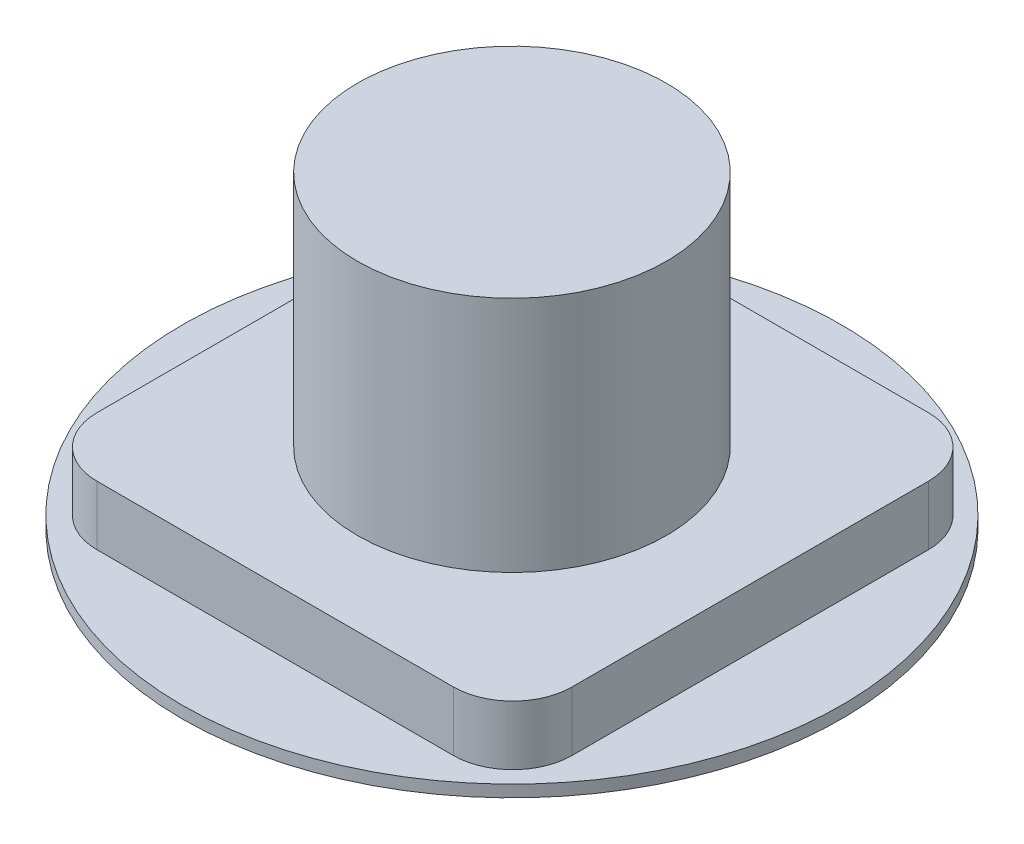
ISO-10303-21;
HEADER;
FILE_DESCRIPTION(('STEP AP214'),'2;1');
FILE_NAME('part.step','',(''),(''),'','','');
FILE_SCHEMA(('AUTOMOTIVE_DESIGN { 1 0 10303 214 1 1 1 1 }'));
ENDSEC;
DATA;
#1=APPLICATION_CONTEXT('core data for automotive mechanical design processes');
#2=APPLICATION_PROTOCOL_DEFINITION('international standard','automotive_design',2000,#1);
#3=PRODUCT_CONTEXT('',#1,'mechanical');
#4=PRODUCT('Part','Part','',(#3));
#5=PRODUCT_RELATED_PRODUCT_CATEGORY('part','',(#4));
#6=PRODUCT_DEFINITION_FORMATION('','',#4);
#7=PRODUCT_DEFINITION_CONTEXT('part definition',#1,'design');
#8=PRODUCT_DEFINITION('design','',#6,#7);
#9=PRODUCT_DEFINITION_SHAPE('','',#8);
#10=(LENGTH_UNIT() NAMED_UNIT(*) SI_UNIT(.MILLI.,.METRE.));
#11=(NAMED_UNIT(*) PLANE_ANGLE_UNIT() SI_UNIT($,.RADIAN.));
#12=(NAMED_UNIT(*) SI_UNIT($,.STERADIAN.) SOLID_ANGLE_UNIT());
#13=UNCERTAINTY_MEASURE_WITH_UNIT(LENGTH_MEASURE(1.E-05),#10,'distance_accuracy_value','');
#14=(GEOMETRIC_REPRESENTATION_CONTEXT(3) GLOBAL_UNCERTAINTY_ASSIGNED_CONTEXT((#13)) GLOBAL_UNIT_ASSIGNED_CONTEXT((#10,
#11,#12)) REPRESENTATION_CONTEXT('',''));
#15=CARTESIAN_POINT('',(0.,0.,0.));
#16=DIRECTION('',(0.,0.,1.));
#17=DIRECTION('',(1.,0.,0.));
#18=AXIS2_PLACEMENT_3D('',#15,#16,#17);
#19=CARTESIAN_POINT('',(0.,10.,0.));
#20=DIRECTION('',(0.,1.,0.));
#21=DIRECTION('',(0.,0.,1.));
#22=AXIS2_PLACEMENT_3D('',#19,#20,#21);
#23=PLANE('',#22);
#24=CARTESIAN_POINT('',(0.,10.,0.));
#25=DIRECTION('',(0.,1.,0.));
#26=DIRECTION('',(0.,0.,1.));
#27=AXIS2_PLACEMENT_3D('',#24,#25,#26);
#28=CIRCLE('',#27,277.5);
#29=CARTESIAN_POINT('',(0.,10.,277.5));
#30=VERTEX_POINT('',#29);
#31=EDGE_CURVE('E187',#30,#30,#28,.T.);
#32=ORIENTED_EDGE('',*,*,#31,.T.);
#33=EDGE_LOOP('',(#32));
#34=FACE_BOUND('',#33,.T.);
#35=DIRECTION('',(0.,0.,1.));
#36=VECTOR('',#35,1.);
#37=CARTESIAN_POINT('',(-199.348769717214,10.,-200.));
#38=LINE('',#37,#36);
#39=CARTESIAN_POINT('',(-199.348769717214,10.,-150.));
#40=VERTEX_POINT('',#39);
#41=CARTESIAN_POINT('',(-199.348769717214,10.,150.));
#42=VERTEX_POINT('',#41);
#43=EDGE_CURVE('E109',#40,#42,#38,.T.);
#44=ORIENTED_EDGE('',*,*,#43,.F.);
#45=CARTESIAN_POINT('',(-149.348769717214,10.,-150.));
#46=DIRECTION('',(0.,1.,0.));
#47=DIRECTION('',(0.,0.,1.));
#48=AXIS2_PLACEMENT_3D('',#45,#46,#47);
#49=CIRCLE('',#48,50.);
#50=CARTESIAN_POINT('',(-149.348769717214,10.,-200.));
#51=VERTEX_POINT('',#50);
#52=EDGE_CURVE('E155',#40,#51,#49,.F.);
#53=ORIENTED_EDGE('',*,*,#52,.T.);
#54=DIRECTION('',(-1.,0.,0.));
#55=VECTOR('',#54,1.);
#56=CARTESIAN_POINT('',(-199.348769717214,10.,-200.));
#57=LINE('',#56,#55);
#58=CARTESIAN_POINT('',(150.651230282786,10.,-200.));
#59=VERTEX_POINT('',#58);
#60=EDGE_CURVE('E123',#59,#51,#57,.T.);
#61=ORIENTED_EDGE('',*,*,#60,.F.);
#62=CARTESIAN_POINT('',(150.651230282786,10.,-150.));
#63=DIRECTION('',(0.,1.,0.));
#64=DIRECTION('',(0.,0.,1.));
#65=AXIS2_PLACEMENT_3D('',#62,#63,#64);
#66=CIRCLE('',#65,50.);
#67=CARTESIAN_POINT('',(200.651230282786,10.,-150.));
#68=VERTEX_POINT('',#67);
#69=EDGE_CURVE('E157',#59,#68,#66,.F.);
#70=ORIENTED_EDGE('',*,*,#69,.T.);
#71=DIRECTION('',(0.,0.,-1.));
#72=VECTOR('',#71,1.);
#73=CARTESIAN_POINT('',(200.651230282786,10.,-200.));
#74=LINE('',#73,#72);
#75=CARTESIAN_POINT('',(200.651230282786,10.,150.));
#76=VERTEX_POINT('',#75);
#77=EDGE_CURVE('E127',#76,#68,#74,.T.);
#78=ORIENTED_EDGE('',*,*,#77,.F.);
#79=CARTESIAN_POINT('',(150.651230282786,10.,150.));
#80=DIRECTION('',(0.,1.,0.));
#81=DIRECTION('',(0.,0.,1.));
#82=AXIS2_PLACEMENT_3D('',#79,#80,#81);
#83=CIRCLE('',#82,50.);
#84=CARTESIAN_POINT('',(150.651230282786,10.,200.));
#85=VERTEX_POINT('',#84);
#86=EDGE_CURVE('E56',#76,#85,#83,.F.);
#87=ORIENTED_EDGE('',*,*,#86,.T.);
#88=DIRECTION('',(1.,0.,0.));
#89=VECTOR('',#88,1.);
#90=CARTESIAN_POINT('',(-199.348769717214,10.,200.));
#91=LINE('',#90,#89);
#92=CARTESIAN_POINT('',(-149.348769717214,10.,200.));
#93=VERTEX_POINT('',#92);
#94=EDGE_CURVE('E110',#93,#85,#91,.T.);
#95=ORIENTED_EDGE('',*,*,#94,.F.);
#96=CARTESIAN_POINT('',(-149.348769717214,10.,150.));
#97=DIRECTION('',(0.,1.,0.));
#98=DIRECTION('',(0.,0.,1.));
#99=AXIS2_PLACEMENT_3D('',#96,#97,#98);
#100=CIRCLE('',#99,50.);
#101=EDGE_CURVE('E43',#93,#42,#100,.F.);
#102=ORIENTED_EDGE('',*,*,#101,.T.);
#103=EDGE_LOOP('',(#44,#53,#61,#70,#78,#87,#95,#102));
#104=FACE_BOUND('',#103,.T.);
#105=ADVANCED_FACE('F39',(#34,#104),#23,.T.);
#106=CARTESIAN_POINT('',(0.,10.,0.));
#107=DIRECTION('',(0.,-1.,0.));
#108=DIRECTION('',(0.,0.,-1.));
#109=AXIS2_PLACEMENT_3D('',#106,#107,#108);
#110=CYLINDRICAL_SURFACE('',#109,277.5);
#111=ORIENTED_EDGE('',*,*,#31,.F.);
#112=EDGE_LOOP('',(#111));
#113=FACE_BOUND('',#112,.T.);
#114=CARTESIAN_POINT('',(0.,0.,0.));
#115=DIRECTION('',(0.,1.,0.));
#116=DIRECTION('',(0.,0.,1.));
#117=AXIS2_PLACEMENT_3D('',#114,#115,#116);
#118=CIRCLE('',#117,277.5);
#119=CARTESIAN_POINT('',(0.,0.,277.5));
#120=VERTEX_POINT('',#119);
#121=EDGE_CURVE('E134',#120,#120,#118,.T.);
#122=ORIENTED_EDGE('',*,*,#121,.T.);
#123=EDGE_LOOP('',(#122));
#124=FACE_BOUND('',#123,.T.);
#125=ADVANCED_FACE('F195',(#113,#124),#110,.T.);
#126=CARTESIAN_POINT('',(0.,0.,0.));
#127=DIRECTION('',(0.,1.,0.));
#128=DIRECTION('',(0.,0.,1.));
#129=AXIS2_PLACEMENT_3D('',#126,#127,#128);
#130=PLANE('',#129);
#131=ORIENTED_EDGE('',*,*,#121,.F.);
#132=EDGE_LOOP('',(#131));
#133=FACE_BOUND('',#132,.T.);
#134=ADVANCED_FACE('F197',(#133),#130,.F.);
#135=CARTESIAN_POINT('',(200.651230282786,60.,-200.));
#136=DIRECTION('',(-1.,0.,0.));
#137=DIRECTION('',(0.,0.,1.));
#138=AXIS2_PLACEMENT_3D('',#135,#136,#137);
#139=PLANE('',#138);
#140=ORIENTED_EDGE('',*,*,#77,.T.);
#141=DIRECTION('',(0.,-1.,0.));
#142=VECTOR('',#141,1.);
#143=CARTESIAN_POINT('',(200.651230282786,60.,-150.));
#144=LINE('',#143,#142);
#145=CARTESIAN_POINT('',(200.651230282786,60.,-150.));
#146=VERTEX_POINT('',#145);
#147=EDGE_CURVE('E150',#68,#146,#144,.F.);
#148=ORIENTED_EDGE('',*,*,#147,.T.);
#149=DIRECTION('',(0.,0.,-1.));
#150=VECTOR('',#149,1.);
#151=CARTESIAN_POINT('',(200.651230282786,60.,-200.));
#152=LINE('',#151,#150);
#153=CARTESIAN_POINT('',(200.651230282786,60.,150.));
#154=VERTEX_POINT('',#153);
#155=EDGE_CURVE('E175',#154,#146,#152,.T.);
#156=ORIENTED_EDGE('',*,*,#155,.F.);
#157=DIRECTION('',(0.,-1.,0.));
#158=VECTOR('',#157,1.);
#159=CARTESIAN_POINT('',(200.651230282786,60.,150.));
#160=LINE('',#159,#158);
#161=EDGE_CURVE('E148',#154,#76,#160,.T.);
#162=ORIENTED_EDGE('',*,*,#161,.T.);
#163=EDGE_LOOP('',(#140,#148,#156,#162));
#164=FACE_BOUND('',#163,.T.);
#165=ADVANCED_FACE('F164',(#164),#139,.F.);
#166=CARTESIAN_POINT('',(-199.348769717214,60.,-200.));
#167=DIRECTION('',(0.,0.,1.));
#168=DIRECTION('',(1.,0.,0.));
#169=AXIS2_PLACEMENT_3D('',#166,#167,#168);
#170=PLANE('',#169);
#171=ORIENTED_EDGE('',*,*,#60,.T.);
#172=DIRECTION('',(0.,-1.,0.));
#173=VECTOR('',#172,1.);
#174=CARTESIAN_POINT('',(-149.348769717214,60.,-200.));
#175=LINE('',#174,#173);
#176=CARTESIAN_POINT('',(-149.348769717214,60.,-200.));
#177=VERTEX_POINT('',#176);
#178=EDGE_CURVE('E139',#51,#177,#175,.F.);
#179=ORIENTED_EDGE('',*,*,#178,.T.);
#180=DIRECTION('',(-1.,0.,0.));
#181=VECTOR('',#180,1.);
#182=CARTESIAN_POINT('',(-199.348769717214,60.,-200.));
#183=LINE('',#182,#181);
#184=CARTESIAN_POINT('',(150.651230282786,60.,-200.));
#185=VERTEX_POINT('',#184);
#186=EDGE_CURVE('E173',#185,#177,#183,.T.);
#187=ORIENTED_EDGE('',*,*,#186,.F.);
#188=DIRECTION('',(0.,-1.,0.));
#189=VECTOR('',#188,1.);
#190=CARTESIAN_POINT('',(150.651230282786,60.,-200.));
#191=LINE('',#190,#189);
#192=EDGE_CURVE('E129',#185,#59,#191,.T.);
#193=ORIENTED_EDGE('',*,*,#192,.T.);
#194=EDGE_LOOP('',(#171,#179,#187,#193));
#195=FACE_BOUND('',#194,.T.);
#196=ADVANCED_FACE('F177',(#195),#170,.F.);
#197=CARTESIAN_POINT('',(-199.348769717214,60.,-200.));
#198=DIRECTION('',(1.,0.,0.));
#199=DIRECTION('',(0.,0.,-1.));
#200=AXIS2_PLACEMENT_3D('',#197,#198,#199);
#201=PLANE('',#200);
#202=DIRECTION('',(0.,0.,1.));
#203=VECTOR('',#202,1.);
#204=CARTESIAN_POINT('',(-199.348769717214,60.,-200.));
#205=LINE('',#204,#203);
#206=CARTESIAN_POINT('',(-199.348769717214,60.,-150.));
#207=VERTEX_POINT('',#206);
#208=CARTESIAN_POINT('',(-199.348769717214,60.,150.));
#209=VERTEX_POINT('',#208);
#210=EDGE_CURVE('E179',#207,#209,#205,.T.);
#211=ORIENTED_EDGE('',*,*,#210,.F.);
#212=DIRECTION('',(0.,-1.,0.));
#213=VECTOR('',#212,1.);
#214=CARTESIAN_POINT('',(-199.348769717214,60.,-150.));
#215=LINE('',#214,#213);
#216=EDGE_CURVE('E122',#207,#40,#215,.T.);
#217=ORIENTED_EDGE('',*,*,#216,.T.);
#218=ORIENTED_EDGE('',*,*,#43,.T.);
#219=DIRECTION('',(0.,-1.,0.));
#220=VECTOR('',#219,1.);
#221=CARTESIAN_POINT('',(-199.348769717214,60.,150.));
#222=LINE('',#221,#220);
#223=EDGE_CURVE('E119',#42,#209,#222,.F.);
#224=ORIENTED_EDGE('',*,*,#223,.T.);
#225=EDGE_LOOP('',(#211,#217,#218,#224));
#226=FACE_BOUND('',#225,.T.);
#227=ADVANCED_FACE('F118',(#226),#201,.F.);
#228=CARTESIAN_POINT('',(-199.348769717214,60.,200.));
#229=DIRECTION('',(0.,0.,-1.));
#230=DIRECTION('',(-1.,0.,0.));
#231=AXIS2_PLACEMENT_3D('',#228,#229,#230);
#232=PLANE('',#231);
#233=ORIENTED_EDGE('',*,*,#94,.T.);
#234=DIRECTION('',(0.,-1.,0.));
#235=VECTOR('',#234,1.);
#236=CARTESIAN_POINT('',(150.651230282786,60.,200.));
#237=LINE('',#236,#235);
#238=CARTESIAN_POINT('',(150.651230282786,60.,200.));
#239=VERTEX_POINT('',#238);
#240=EDGE_CURVE('E82',#85,#239,#237,.F.);
#241=ORIENTED_EDGE('',*,*,#240,.T.);
#242=DIRECTION('',(1.,0.,0.));
#243=VECTOR('',#242,1.);
#244=CARTESIAN_POINT('',(-199.348769717214,60.,200.));
#245=LINE('',#244,#243);
#246=CARTESIAN_POINT('',(-149.348769717214,60.,200.));
#247=VERTEX_POINT('',#246);
#248=EDGE_CURVE('E181',#247,#239,#245,.T.);
#249=ORIENTED_EDGE('',*,*,#248,.F.);
#250=DIRECTION('',(0.,-1.,0.));
#251=VECTOR('',#250,1.);
#252=CARTESIAN_POINT('',(-149.348769717214,60.,200.));
#253=LINE('',#252,#251);
#254=EDGE_CURVE('E152',#247,#93,#253,.T.);
#255=ORIENTED_EDGE('',*,*,#254,.T.);
#256=EDGE_LOOP('',(#233,#241,#249,#255));
#257=FACE_BOUND('',#256,.T.);
#258=ADVANCED_FACE('F216',(#257),#232,.F.);
#259=CARTESIAN_POINT('',(0.,60.,0.));
#260=DIRECTION('',(0.,1.,0.));
#261=DIRECTION('',(0.,0.,1.));
#262=AXIS2_PLACEMENT_3D('',#259,#260,#261);
#263=PLANE('',#262);
#264=CARTESIAN_POINT('',(0.,60.,0.));
#265=DIRECTION('',(0.,1.,0.));
#266=DIRECTION('',(0.,0.,1.));
#267=AXIS2_PLACEMENT_3D('',#264,#265,#266);
#268=CIRCLE('',#267,130.);
#269=CARTESIAN_POINT('',(0.,60.,130.));
#270=VERTEX_POINT('',#269);
#271=EDGE_CURVE('E11',#270,#270,#268,.T.);
#272=ORIENTED_EDGE('',*,*,#271,.F.);
#273=EDGE_LOOP('',(#272));
#274=FACE_BOUND('',#273,.T.);
#275=ORIENTED_EDGE('',*,*,#186,.T.);
#276=CARTESIAN_POINT('',(-149.348769717214,60.,-150.));
#277=DIRECTION('',(0.,1.,0.));
#278=DIRECTION('',(0.,0.,1.));
#279=AXIS2_PLACEMENT_3D('',#276,#277,#278);
#280=CIRCLE('',#279,50.);
#281=EDGE_CURVE('E146',#177,#207,#280,.T.);
#282=ORIENTED_EDGE('',*,*,#281,.T.);
#283=ORIENTED_EDGE('',*,*,#210,.T.);
#284=CARTESIAN_POINT('',(-149.348769717214,60.,150.));
#285=DIRECTION('',(0.,1.,0.));
#286=DIRECTION('',(0.,0.,1.));
#287=AXIS2_PLACEMENT_3D('',#284,#285,#286);
#288=CIRCLE('',#287,50.);
#289=EDGE_CURVE('E126',#209,#247,#288,.T.);
#290=ORIENTED_EDGE('',*,*,#289,.T.);
#291=ORIENTED_EDGE('',*,*,#248,.T.);
#292=CARTESIAN_POINT('',(150.651230282786,60.,150.));
#293=DIRECTION('',(0.,1.,0.));
#294=DIRECTION('',(0.,0.,1.));
#295=AXIS2_PLACEMENT_3D('',#292,#293,#294);
#296=CIRCLE('',#295,50.);
#297=EDGE_CURVE('E142',#239,#154,#296,.T.);
#298=ORIENTED_EDGE('',*,*,#297,.T.);
#299=ORIENTED_EDGE('',*,*,#155,.T.);
#300=CARTESIAN_POINT('',(150.651230282786,60.,-150.));
#301=DIRECTION('',(0.,1.,0.));
#302=DIRECTION('',(0.,0.,1.));
#303=AXIS2_PLACEMENT_3D('',#300,#301,#302);
#304=CIRCLE('',#303,50.);
#305=EDGE_CURVE('E144',#146,#185,#304,.T.);
#306=ORIENTED_EDGE('',*,*,#305,.T.);
#307=EDGE_LOOP('',(#275,#282,#283,#290,#291,#298,#299,#306));
#308=FACE_BOUND('',#307,.T.);
#309=ADVANCED_FACE('F172',(#274,#308),#263,.T.);
#310=CARTESIAN_POINT('',(-149.348769717214,60.,-150.));
#311=DIRECTION('',(0.,-1.,0.));
#312=DIRECTION('',(0.,0.,-1.));
#313=AXIS2_PLACEMENT_3D('',#310,#311,#312);
#314=CYLINDRICAL_SURFACE('',#313,50.);
#315=ORIENTED_EDGE('',*,*,#281,.F.);
#316=ORIENTED_EDGE('',*,*,#178,.F.);
#317=ORIENTED_EDGE('',*,*,#52,.F.);
#318=ORIENTED_EDGE('',*,*,#216,.F.);
#319=EDGE_LOOP('',(#315,#316,#317,#318));
#320=FACE_BOUND('',#319,.T.);
#321=ADVANCED_FACE('F221',(#320),#314,.T.);
#322=CARTESIAN_POINT('',(150.651230282786,60.,-150.));
#323=DIRECTION('',(0.,-1.,0.));
#324=DIRECTION('',(0.,0.,-1.));
#325=AXIS2_PLACEMENT_3D('',#322,#323,#324);
#326=CYLINDRICAL_SURFACE('',#325,50.);
#327=ORIENTED_EDGE('',*,*,#305,.F.);
#328=ORIENTED_EDGE('',*,*,#147,.F.);
#329=ORIENTED_EDGE('',*,*,#69,.F.);
#330=ORIENTED_EDGE('',*,*,#192,.F.);
#331=EDGE_LOOP('',(#327,#328,#329,#330));
#332=FACE_BOUND('',#331,.T.);
#333=ADVANCED_FACE('F168',(#332),#326,.T.);
#334=CARTESIAN_POINT('',(150.651230282786,60.,150.));
#335=DIRECTION('',(0.,-1.,0.));
#336=DIRECTION('',(0.,0.,-1.));
#337=AXIS2_PLACEMENT_3D('',#334,#335,#336);
#338=CYLINDRICAL_SURFACE('',#337,50.);
#339=ORIENTED_EDGE('',*,*,#297,.F.);
#340=ORIENTED_EDGE('',*,*,#240,.F.);
#341=ORIENTED_EDGE('',*,*,#86,.F.);
#342=ORIENTED_EDGE('',*,*,#161,.F.);
#343=EDGE_LOOP('',(#339,#340,#341,#342));
#344=FACE_BOUND('',#343,.T.);
#345=ADVANCED_FACE('F247',(#344),#338,.T.);
#346=CARTESIAN_POINT('',(-149.348769717214,60.,150.));
#347=DIRECTION('',(0.,-1.,0.));
#348=DIRECTION('',(0.,0.,-1.));
#349=AXIS2_PLACEMENT_3D('',#346,#347,#348);
#350=CYLINDRICAL_SURFACE('',#349,50.);
#351=ORIENTED_EDGE('',*,*,#289,.F.);
#352=ORIENTED_EDGE('',*,*,#223,.F.);
#353=ORIENTED_EDGE('',*,*,#101,.F.);
#354=ORIENTED_EDGE('',*,*,#254,.F.);
#355=EDGE_LOOP('',(#351,#352,#353,#354));
#356=FACE_BOUND('',#355,.T.);
#357=ADVANCED_FACE('F41',(#356),#350,.T.);
#358=CARTESIAN_POINT('',(0.,260.,0.));
#359=DIRECTION('',(0.,-1.,0.));
#360=DIRECTION('',(0.,0.,-1.));
#361=AXIS2_PLACEMENT_3D('',#358,#359,#360);
#362=CYLINDRICAL_SURFACE('',#361,130.);
#363=CARTESIAN_POINT('',(0.,260.,0.));
#364=DIRECTION('',(0.,1.,0.));
#365=DIRECTION('',(0.,0.,1.));
#366=AXIS2_PLACEMENT_3D('',#363,#364,#365);
#367=CIRCLE('',#366,130.);
#368=CARTESIAN_POINT('',(0.,260.,130.));
#369=VERTEX_POINT('',#368);
#370=EDGE_CURVE('E183',#369,#369,#367,.T.);
#371=ORIENTED_EDGE('',*,*,#370,.F.);
#372=EDGE_LOOP('',(#371));
#373=FACE_BOUND('',#372,.T.);
#374=ORIENTED_EDGE('',*,*,#271,.T.);
#375=EDGE_LOOP('',(#374));
#376=FACE_BOUND('',#375,.T.);
#377=ADVANCED_FACE('F223',(#373,#376),#362,.T.);
#378=CARTESIAN_POINT('',(0.,260.,0.));
#379=DIRECTION('',(0.,1.,0.));
#380=DIRECTION('',(0.,0.,1.));
#381=AXIS2_PLACEMENT_3D('',#378,#379,#380);
#382=PLANE('',#381);
#383=ORIENTED_EDGE('',*,*,#370,.T.);
#384=EDGE_LOOP('',(#383));
#385=FACE_BOUND('',#384,.T.);
#386=ADVANCED_FACE('F226',(#385),#382,.T.);
#387=CLOSED_SHELL('',(#105,#125,#134,#165,#196,#227,#258,#309,#321,#333,#345,#357,#377,#386));
#388=MANIFOLD_SOLID_BREP('B2',#387);
#389=ADVANCED_BREP_SHAPE_REPRESENTATION('',(#18,#388),#14);
#390=SHAPE_DEFINITION_REPRESENTATION(#9,#389);
ENDSEC;
END-ISO-10303-21;
